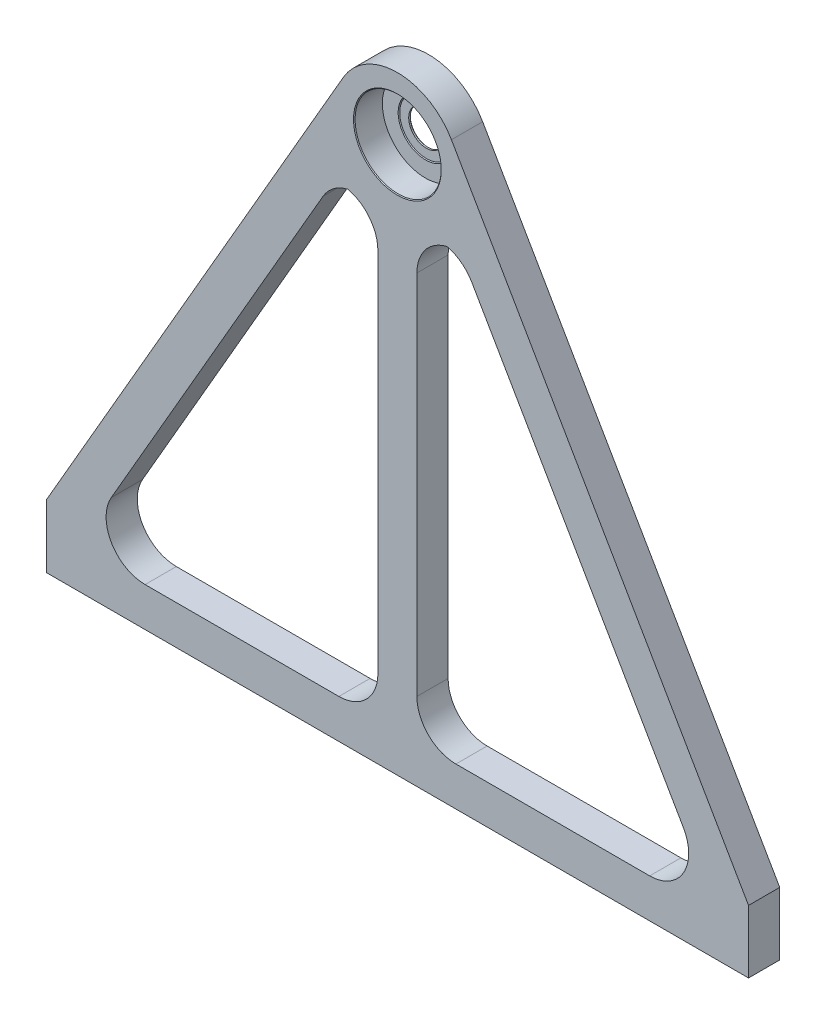
ISO-10303-21;
HEADER;
FILE_DESCRIPTION(('STEP AP214'),'2;1');
FILE_NAME('part.step','',(''),(''),'','','');
FILE_SCHEMA(('AUTOMOTIVE_DESIGN { 1 0 10303 214 1 1 1 1 }'));
ENDSEC;
DATA;
#1=APPLICATION_CONTEXT('core data for automotive mechanical design processes');
#2=APPLICATION_PROTOCOL_DEFINITION('international standard','automotive_design',2000,#1);
#3=PRODUCT_CONTEXT('',#1,'mechanical');
#4=PRODUCT('Part','Part','',(#3));
#5=PRODUCT_RELATED_PRODUCT_CATEGORY('part','',(#4));
#6=PRODUCT_DEFINITION_FORMATION('','',#4);
#7=PRODUCT_DEFINITION_CONTEXT('part definition',#1,'design');
#8=PRODUCT_DEFINITION('design','',#6,#7);
#9=PRODUCT_DEFINITION_SHAPE('','',#8);
#10=(LENGTH_UNIT() NAMED_UNIT(*) SI_UNIT(.MILLI.,.METRE.));
#11=(NAMED_UNIT(*) PLANE_ANGLE_UNIT() SI_UNIT($,.RADIAN.));
#12=(NAMED_UNIT(*) SI_UNIT($,.STERADIAN.) SOLID_ANGLE_UNIT());
#13=UNCERTAINTY_MEASURE_WITH_UNIT(LENGTH_MEASURE(1.E-05),#10,'distance_accuracy_value','');
#14=(GEOMETRIC_REPRESENTATION_CONTEXT(3) GLOBAL_UNCERTAINTY_ASSIGNED_CONTEXT((#13)) GLOBAL_UNIT_ASSIGNED_CONTEXT((#10,
#11,#12)) REPRESENTATION_CONTEXT('',''));
#15=CARTESIAN_POINT('',(0.,0.,0.));
#16=DIRECTION('',(0.,0.,1.));
#17=DIRECTION('',(1.,0.,0.));
#18=AXIS2_PLACEMENT_3D('',#15,#16,#17);
#19=CARTESIAN_POINT('',(13.856406460551,148.,4.));
#20=DIRECTION('',(-0.866025403784437,-0.500000000000004,0.));
#21=DIRECTION('',(0.500000000000004,-0.866025403784437,0.));
#22=AXIS2_PLACEMENT_3D('',#19,#20,#21);
#23=PLANE('',#22);
#24=DIRECTION('',(0.,0.,1.));
#25=VECTOR('',#24,1.);
#26=CARTESIAN_POINT('',(90.,16.1154273188023,4.));
#27=LINE('',#26,#25);
#28=CARTESIAN_POINT('',(90.,16.1154273188024,-4.));
#29=VERTEX_POINT('',#28);
#30=CARTESIAN_POINT('',(90.,16.1154273188024,4.));
#31=VERTEX_POINT('',#30);
#32=EDGE_CURVE('E295',#29,#31,#27,.T.);
#33=ORIENTED_EDGE('',*,*,#32,.F.);
#34=DIRECTION('',(-0.500000000000004,0.866025403784436,0.));
#35=VECTOR('',#34,1.);
#36=CARTESIAN_POINT('',(13.856406460551,148.,-4.));
#37=LINE('',#36,#35);
#38=CARTESIAN_POINT('',(13.856406460551,148.,-4.));
#39=VERTEX_POINT('',#38);
#40=EDGE_CURVE('E338',#29,#39,#37,.T.);
#41=ORIENTED_EDGE('',*,*,#40,.T.);
#42=DIRECTION('',(0.,0.,-1.));
#43=VECTOR('',#42,1.);
#44=CARTESIAN_POINT('',(13.856406460551,148.,4.));
#45=LINE('',#44,#43);
#46=CARTESIAN_POINT('',(13.856406460551,148.,4.));
#47=VERTEX_POINT('',#46);
#48=EDGE_CURVE('E207',#47,#39,#45,.T.);
#49=ORIENTED_EDGE('',*,*,#48,.F.);
#50=DIRECTION('',(-0.500000000000004,0.866025403784436,0.));
#51=VECTOR('',#50,1.);
#52=CARTESIAN_POINT('',(13.856406460551,148.,4.));
#53=LINE('',#52,#51);
#54=EDGE_CURVE('E198',#31,#47,#53,.T.);
#55=ORIENTED_EDGE('',*,*,#54,.F.);
#56=EDGE_LOOP('',(#33,#41,#49,#55));
#57=FACE_BOUND('',#56,.T.);
#58=ADVANCED_FACE('F44',(#57),#23,.F.);
#59=CARTESIAN_POINT('',(-99.3042463006165,0.,4.));
#60=DIRECTION('',(0.866025403784436,-0.500000000000004,0.));
#61=DIRECTION('',(0.500000000000004,0.866025403784437,0.));
#62=AXIS2_PLACEMENT_3D('',#59,#60,#61);
#63=PLANE('',#62);
#64=DIRECTION('',(0.,0.,-1.));
#65=VECTOR('',#64,1.);
#66=CARTESIAN_POINT('',(-90.,16.1154273188024,4.));
#67=LINE('',#66,#65);
#68=CARTESIAN_POINT('',(-90.,16.1154273188023,4.));
#69=VERTEX_POINT('',#68);
#70=CARTESIAN_POINT('',(-90.,16.1154273188023,-4.));
#71=VERTEX_POINT('',#70);
#72=EDGE_CURVE('E59',#69,#71,#67,.T.);
#73=ORIENTED_EDGE('',*,*,#72,.F.);
#74=DIRECTION('',(-0.500000000000004,-0.866025403784436,0.));
#75=VECTOR('',#74,1.);
#76=CARTESIAN_POINT('',(-99.3042463006165,0.,4.));
#77=LINE('',#76,#75);
#78=CARTESIAN_POINT('',(-13.856406460551,148.,4.));
#79=VERTEX_POINT('',#78);
#80=EDGE_CURVE('E208',#79,#69,#77,.T.);
#81=ORIENTED_EDGE('',*,*,#80,.F.);
#82=DIRECTION('',(0.,0.,-1.));
#83=VECTOR('',#82,1.);
#84=CARTESIAN_POINT('',(-13.856406460551,148.,4.));
#85=LINE('',#84,#83);
#86=CARTESIAN_POINT('',(-13.856406460551,148.,-4.));
#87=VERTEX_POINT('',#86);
#88=EDGE_CURVE('E204',#79,#87,#85,.T.);
#89=ORIENTED_EDGE('',*,*,#88,.T.);
#90=DIRECTION('',(-0.500000000000004,-0.866025403784436,0.));
#91=VECTOR('',#90,1.);
#92=CARTESIAN_POINT('',(-99.3042463006165,0.,-4.));
#93=LINE('',#92,#91);
#94=EDGE_CURVE('E196',#87,#71,#93,.T.);
#95=ORIENTED_EDGE('',*,*,#94,.T.);
#96=EDGE_LOOP('',(#73,#81,#89,#95));
#97=FACE_BOUND('',#96,.T.);
#98=ADVANCED_FACE('F353',(#97),#63,.F.);
#99=CARTESIAN_POINT('',(0.,0.,4.));
#100=DIRECTION('',(0.,1.,0.));
#101=DIRECTION('',(0.,0.,1.));
#102=AXIS2_PLACEMENT_3D('',#99,#100,#101);
#103=PLANE('',#102);
#104=DIRECTION('',(0.,0.,1.));
#105=VECTOR('',#104,1.);
#106=CARTESIAN_POINT('',(-90.,0.,-4.));
#107=LINE('',#106,#105);
#108=CARTESIAN_POINT('',(-90.,0.,-4.));
#109=VERTEX_POINT('',#108);
#110=CARTESIAN_POINT('',(-90.,0.,4.));
#111=VERTEX_POINT('',#110);
#112=EDGE_CURVE('E179',#109,#111,#107,.T.);
#113=ORIENTED_EDGE('',*,*,#112,.F.);
#114=DIRECTION('',(1.,0.,0.));
#115=VECTOR('',#114,1.);
#116=CARTESIAN_POINT('',(0.,0.,-4.));
#117=LINE('',#116,#115);
#118=CARTESIAN_POINT('',(90.,0.,-4.));
#119=VERTEX_POINT('',#118);
#120=EDGE_CURVE('E189',#109,#119,#117,.T.);
#121=ORIENTED_EDGE('',*,*,#120,.T.);
#122=DIRECTION('',(0.,0.,1.));
#123=VECTOR('',#122,1.);
#124=CARTESIAN_POINT('',(90.,0.,-4.));
#125=LINE('',#124,#123);
#126=CARTESIAN_POINT('',(90.,0.,4.));
#127=VERTEX_POINT('',#126);
#128=EDGE_CURVE('E66',#119,#127,#125,.T.);
#129=ORIENTED_EDGE('',*,*,#128,.T.);
#130=DIRECTION('',(1.,0.,0.));
#131=VECTOR('',#130,1.);
#132=CARTESIAN_POINT('',(99.3042463006165,0.,4.));
#133=LINE('',#132,#131);
#134=EDGE_CURVE('E191',#111,#127,#133,.T.);
#135=ORIENTED_EDGE('',*,*,#134,.F.);
#136=EDGE_LOOP('',(#113,#121,#129,#135));
#137=FACE_BOUND('',#136,.T.);
#138=ADVANCED_FACE('F188',(#137),#103,.F.);
#139=CARTESIAN_POINT('',(0.,140.,4.));
#140=DIRECTION('',(0.,0.,-1.));
#141=DIRECTION('',(-1.,0.,0.));
#142=AXIS2_PLACEMENT_3D('',#139,#140,#141);
#143=PLANE('',#142);
#144=DIRECTION('',(1.,0.,0.));
#145=VECTOR('',#144,1.);
#146=CARTESIAN_POINT('',(-81.9837382249276,10.,4.));
#147=LINE('',#146,#145);
#148=CARTESIAN_POINT('',(15.,9.99999999999999,4.));
#149=VERTEX_POINT('',#148);
#150=CARTESIAN_POINT('',(64.6632301492388,9.99999999999999,4.));
#151=VERTEX_POINT('',#150);
#152=EDGE_CURVE('E325',#149,#151,#147,.T.);
#153=ORIENTED_EDGE('',*,*,#152,.F.);
#154=CARTESIAN_POINT('',(15.,20.,4.));
#155=DIRECTION('',(0.,0.,-1.));
#156=DIRECTION('',(-1.,0.,0.));
#157=AXIS2_PLACEMENT_3D('',#154,#155,#156);
#158=CIRCLE('',#157,10.);
#159=CARTESIAN_POINT('',(5.00000000000001,20.,4.));
#160=VERTEX_POINT('',#159);
#161=EDGE_CURVE('E260',#149,#160,#158,.T.);
#162=ORIENTED_EDGE('',*,*,#161,.T.);
#163=DIRECTION('',(0.,1.,0.));
#164=VECTOR('',#163,1.);
#165=CARTESIAN_POINT('',(5.00000000000001,10.,4.));
#166=LINE('',#165,#164);
#167=CARTESIAN_POINT('',(5.,114.,4.));
#168=VERTEX_POINT('',#167);
#169=EDGE_CURVE('E302',#160,#168,#166,.T.);
#170=ORIENTED_EDGE('',*,*,#169,.T.);
#171=CARTESIAN_POINT('',(15.,114.,4.));
#172=DIRECTION('',(0.,0.,-1.));
#173=DIRECTION('',(-1.,0.,0.));
#174=AXIS2_PLACEMENT_3D('',#171,#172,#173);
#175=CIRCLE('',#174,10.);
#176=CARTESIAN_POINT('',(12.6961524227067,123.730996163836,4.));
#177=VERTEX_POINT('',#176);
#178=EDGE_CURVE('E264',#168,#177,#175,.T.);
#179=ORIENTED_EDGE('',*,*,#178,.T.);
#180=CARTESIAN_POINT('',(10.3923048454134,114.,4.));
#181=DIRECTION('',(0.,0.,-1.));
#182=DIRECTION('',(-1.,0.,0.));
#183=AXIS2_PLACEMENT_3D('',#180,#181,#182);
#184=CIRCLE('',#183,10.);
#185=CARTESIAN_POINT('',(19.0525588832578,119.,4.));
#186=VERTEX_POINT('',#185);
#187=EDGE_CURVE('E276',#177,#186,#184,.T.);
#188=ORIENTED_EDGE('',*,*,#187,.T.);
#189=DIRECTION('',(-0.500000000000004,0.866025403784436,0.));
#190=VECTOR('',#189,1.);
#191=CARTESIAN_POINT('',(81.9837382249277,9.99999999999999,4.));
#192=LINE('',#191,#190);
#193=CARTESIAN_POINT('',(73.3234841870832,25.,4.));
#194=VERTEX_POINT('',#193);
#195=EDGE_CURVE('E315',#194,#186,#192,.T.);
#196=ORIENTED_EDGE('',*,*,#195,.F.);
#197=CARTESIAN_POINT('',(64.6632301492388,20.,4.));
#198=DIRECTION('',(0.,0.,-1.));
#199=DIRECTION('',(-1.,0.,0.));
#200=AXIS2_PLACEMENT_3D('',#197,#198,#199);
#201=CIRCLE('',#200,10.);
#202=EDGE_CURVE('E272',#194,#151,#201,.T.);
#203=ORIENTED_EDGE('',*,*,#202,.T.);
#204=EDGE_LOOP('',(#153,#162,#170,#179,#188,#196,#203));
#205=FACE_BOUND('',#204,.T.);
#206=CARTESIAN_POINT('',(-64.6632301492388,10.,4.));
#207=VERTEX_POINT('',#206);
#208=CARTESIAN_POINT('',(-15.,10.,4.));
#209=VERTEX_POINT('',#208);
#210=EDGE_CURVE('E328',#207,#209,#147,.T.);
#211=ORIENTED_EDGE('',*,*,#210,.F.);
#212=CARTESIAN_POINT('',(-64.6632301492388,20.,4.));
#213=DIRECTION('',(0.,0.,-1.));
#214=DIRECTION('',(-1.,0.,0.));
#215=AXIS2_PLACEMENT_3D('',#212,#213,#214);
#216=CIRCLE('',#215,10.);
#217=CARTESIAN_POINT('',(-73.3234841870831,25.,4.));
#218=VERTEX_POINT('',#217);
#219=EDGE_CURVE('E284',#207,#218,#216,.T.);
#220=ORIENTED_EDGE('',*,*,#219,.T.);
#221=DIRECTION('',(-0.500000000000004,-0.866025403784436,0.));
#222=VECTOR('',#221,1.);
#223=CARTESIAN_POINT('',(-16.1658075373097,124.,4.));
#224=LINE('',#223,#222);
#225=CARTESIAN_POINT('',(-19.0525588832578,119.,4.));
#226=VERTEX_POINT('',#225);
#227=EDGE_CURVE('E308',#226,#218,#224,.T.);
#228=ORIENTED_EDGE('',*,*,#227,.F.);
#229=CARTESIAN_POINT('',(-10.3923048454134,114.,4.));
#230=DIRECTION('',(0.,0.,-1.));
#231=DIRECTION('',(-1.,0.,0.));
#232=AXIS2_PLACEMENT_3D('',#229,#230,#231);
#233=CIRCLE('',#232,10.);
#234=CARTESIAN_POINT('',(-12.6961524227067,123.730996163836,4.));
#235=VERTEX_POINT('',#234);
#236=EDGE_CURVE('E280',#226,#235,#233,.T.);
#237=ORIENTED_EDGE('',*,*,#236,.T.);
#238=CARTESIAN_POINT('',(-15.,114.,4.));
#239=DIRECTION('',(0.,0.,-1.));
#240=DIRECTION('',(-1.,0.,0.));
#241=AXIS2_PLACEMENT_3D('',#238,#239,#240);
#242=CIRCLE('',#241,10.);
#243=CARTESIAN_POINT('',(-5.,114.,4.));
#244=VERTEX_POINT('',#243);
#245=EDGE_CURVE('E268',#235,#244,#242,.T.);
#246=ORIENTED_EDGE('',*,*,#245,.T.);
#247=DIRECTION('',(0.,1.,0.));
#248=VECTOR('',#247,1.);
#249=CARTESIAN_POINT('',(-4.99999999999999,10.,4.));
#250=LINE('',#249,#248);
#251=CARTESIAN_POINT('',(-4.99999999999999,20.,4.));
#252=VERTEX_POINT('',#251);
#253=EDGE_CURVE('E299',#252,#244,#250,.T.);
#254=ORIENTED_EDGE('',*,*,#253,.F.);
#255=CARTESIAN_POINT('',(-15.,20.,4.));
#256=DIRECTION('',(0.,0.,-1.));
#257=DIRECTION('',(-1.,0.,0.));
#258=AXIS2_PLACEMENT_3D('',#255,#256,#257);
#259=CIRCLE('',#258,10.);
#260=EDGE_CURVE('E256',#252,#209,#259,.T.);
#261=ORIENTED_EDGE('',*,*,#260,.T.);
#262=EDGE_LOOP('',(#211,#220,#228,#237,#246,#254,#261));
#263=FACE_BOUND('',#262,.T.);
#264=CARTESIAN_POINT('',(0.,140.,4.));
#265=DIRECTION('',(0.,0.,-1.));
#266=DIRECTION('',(-1.,0.,0.));
#267=AXIS2_PLACEMENT_3D('',#264,#265,#266);
#268=CIRCLE('',#267,11.25);
#269=CARTESIAN_POINT('',(-11.25,140.,4.));
#270=VERTEX_POINT('',#269);
#271=EDGE_CURVE('E214',#270,#270,#268,.T.);
#272=ORIENTED_EDGE('',*,*,#271,.T.);
#273=EDGE_LOOP('',(#272));
#274=FACE_BOUND('',#273,.T.);
#275=DIRECTION('',(0.,-1.,0.));
#276=VECTOR('',#275,1.);
#277=CARTESIAN_POINT('',(-90.,0.,4.));
#278=LINE('',#277,#276);
#279=EDGE_CURVE('E356',#69,#111,#278,.T.);
#280=ORIENTED_EDGE('',*,*,#279,.T.);
#281=ORIENTED_EDGE('',*,*,#134,.T.);
#282=DIRECTION('',(0.,1.,0.));
#283=VECTOR('',#282,1.);
#284=CARTESIAN_POINT('',(90.,0.,4.));
#285=LINE('',#284,#283);
#286=EDGE_CURVE('E359',#127,#31,#285,.T.);
#287=ORIENTED_EDGE('',*,*,#286,.T.);
#288=ORIENTED_EDGE('',*,*,#54,.T.);
#289=CARTESIAN_POINT('',(0.,140.,4.));
#290=DIRECTION('',(0.,0.,1.));
#291=DIRECTION('',(-1.,0.,0.));
#292=AXIS2_PLACEMENT_3D('',#289,#290,#291);
#293=CIRCLE('',#292,16.);
#294=EDGE_CURVE('E341',#47,#79,#293,.T.);
#295=ORIENTED_EDGE('',*,*,#294,.T.);
#296=ORIENTED_EDGE('',*,*,#80,.T.);
#297=EDGE_LOOP('',(#280,#281,#287,#288,#295,#296));
#298=FACE_BOUND('',#297,.T.);
#299=ADVANCED_FACE('F355',(#205,#263,#274,#298),#143,.F.);
#300=CARTESIAN_POINT('',(0.,140.,-4.));
#301=DIRECTION('',(0.,0.,-1.));
#302=DIRECTION('',(-1.,0.,0.));
#303=AXIS2_PLACEMENT_3D('',#300,#301,#302);
#304=PLANE('',#303);
#305=DIRECTION('',(-0.500000000000004,0.866025403784436,0.));
#306=VECTOR('',#305,1.);
#307=CARTESIAN_POINT('',(81.9837382249277,9.99999999999999,-4.));
#308=LINE('',#307,#306);
#309=CARTESIAN_POINT('',(73.3234841870832,25.,-4.));
#310=VERTEX_POINT('',#309);
#311=CARTESIAN_POINT('',(19.0525588832578,119.,-4.));
#312=VERTEX_POINT('',#311);
#313=EDGE_CURVE('E319',#310,#312,#308,.T.);
#314=ORIENTED_EDGE('',*,*,#313,.T.);
#315=CARTESIAN_POINT('',(10.3923048454134,114.,-4.));
#316=DIRECTION('',(0.,0.,-1.));
#317=DIRECTION('',(-1.,0.,0.));
#318=AXIS2_PLACEMENT_3D('',#315,#316,#317);
#319=CIRCLE('',#318,10.);
#320=CARTESIAN_POINT('',(12.6961524227067,123.730996163836,-4.));
#321=VERTEX_POINT('',#320);
#322=EDGE_CURVE('E278',#312,#321,#319,.F.);
#323=ORIENTED_EDGE('',*,*,#322,.T.);
#324=CARTESIAN_POINT('',(15.,114.,-4.));
#325=DIRECTION('',(0.,0.,-1.));
#326=DIRECTION('',(-1.,0.,0.));
#327=AXIS2_PLACEMENT_3D('',#324,#325,#326);
#328=CIRCLE('',#327,10.);
#329=CARTESIAN_POINT('',(5.,114.,-4.));
#330=VERTEX_POINT('',#329);
#331=EDGE_CURVE('E266',#321,#330,#328,.F.);
#332=ORIENTED_EDGE('',*,*,#331,.T.);
#333=DIRECTION('',(0.,1.,0.));
#334=VECTOR('',#333,1.);
#335=CARTESIAN_POINT('',(5.00000000000001,10.,-4.));
#336=LINE('',#335,#334);
#337=CARTESIAN_POINT('',(5.00000000000001,20.,-4.));
#338=VERTEX_POINT('',#337);
#339=EDGE_CURVE('E289',#338,#330,#336,.T.);
#340=ORIENTED_EDGE('',*,*,#339,.F.);
#341=CARTESIAN_POINT('',(15.,20.,-4.));
#342=DIRECTION('',(0.,0.,-1.));
#343=DIRECTION('',(-1.,0.,0.));
#344=AXIS2_PLACEMENT_3D('',#341,#342,#343);
#345=CIRCLE('',#344,10.);
#346=CARTESIAN_POINT('',(15.,9.99999999999999,-4.));
#347=VERTEX_POINT('',#346);
#348=EDGE_CURVE('E262',#338,#347,#345,.F.);
#349=ORIENTED_EDGE('',*,*,#348,.T.);
#350=DIRECTION('',(1.,0.,0.));
#351=VECTOR('',#350,1.);
#352=CARTESIAN_POINT('',(-81.9837382249276,10.,-4.));
#353=LINE('',#352,#351);
#354=CARTESIAN_POINT('',(64.6632301492388,9.99999999999999,-4.));
#355=VERTEX_POINT('',#354);
#356=EDGE_CURVE('E314',#347,#355,#353,.T.);
#357=ORIENTED_EDGE('',*,*,#356,.T.);
#358=CARTESIAN_POINT('',(64.6632301492388,20.,-4.));
#359=DIRECTION('',(0.,0.,-1.));
#360=DIRECTION('',(-1.,0.,0.));
#361=AXIS2_PLACEMENT_3D('',#358,#359,#360);
#362=CIRCLE('',#361,10.);
#363=EDGE_CURVE('E274',#355,#310,#362,.F.);
#364=ORIENTED_EDGE('',*,*,#363,.T.);
#365=EDGE_LOOP('',(#314,#323,#332,#340,#349,#357,#364));
#366=FACE_BOUND('',#365,.T.);
#367=CARTESIAN_POINT('',(-15.,114.,-4.));
#368=DIRECTION('',(0.,0.,-1.));
#369=DIRECTION('',(-1.,0.,0.));
#370=AXIS2_PLACEMENT_3D('',#367,#368,#369);
#371=CIRCLE('',#370,10.);
#372=CARTESIAN_POINT('',(-5.,114.,-4.));
#373=VERTEX_POINT('',#372);
#374=CARTESIAN_POINT('',(-12.6961524227067,123.730996163836,-4.));
#375=VERTEX_POINT('',#374);
#376=EDGE_CURVE('E270',#373,#375,#371,.F.);
#377=ORIENTED_EDGE('',*,*,#376,.T.);
#378=CARTESIAN_POINT('',(-10.3923048454134,114.,-4.));
#379=DIRECTION('',(0.,0.,-1.));
#380=DIRECTION('',(-1.,0.,0.));
#381=AXIS2_PLACEMENT_3D('',#378,#379,#380);
#382=CIRCLE('',#381,10.);
#383=CARTESIAN_POINT('',(-19.0525588832578,119.,-4.));
#384=VERTEX_POINT('',#383);
#385=EDGE_CURVE('E282',#375,#384,#382,.F.);
#386=ORIENTED_EDGE('',*,*,#385,.T.);
#387=DIRECTION('',(-0.500000000000004,-0.866025403784436,0.));
#388=VECTOR('',#387,1.);
#389=CARTESIAN_POINT('',(-16.1658075373097,124.,-4.));
#390=LINE('',#389,#388);
#391=CARTESIAN_POINT('',(-73.3234841870831,25.,-4.));
#392=VERTEX_POINT('',#391);
#393=EDGE_CURVE('E311',#384,#392,#390,.T.);
#394=ORIENTED_EDGE('',*,*,#393,.T.);
#395=CARTESIAN_POINT('',(-64.6632301492388,20.,-4.));
#396=DIRECTION('',(0.,0.,-1.));
#397=DIRECTION('',(-1.,0.,0.));
#398=AXIS2_PLACEMENT_3D('',#395,#396,#397);
#399=CIRCLE('',#398,10.);
#400=CARTESIAN_POINT('',(-64.6632301492388,10.,-4.));
#401=VERTEX_POINT('',#400);
#402=EDGE_CURVE('E52',#392,#401,#399,.F.);
#403=ORIENTED_EDGE('',*,*,#402,.T.);
#404=CARTESIAN_POINT('',(-15.,10.,-4.));
#405=VERTEX_POINT('',#404);
#406=EDGE_CURVE('E318',#401,#405,#353,.T.);
#407=ORIENTED_EDGE('',*,*,#406,.T.);
#408=CARTESIAN_POINT('',(-15.,20.,-4.));
#409=DIRECTION('',(0.,0.,-1.));
#410=DIRECTION('',(-1.,0.,0.));
#411=AXIS2_PLACEMENT_3D('',#408,#409,#410);
#412=CIRCLE('',#411,10.);
#413=CARTESIAN_POINT('',(-4.99999999999999,20.,-4.));
#414=VERTEX_POINT('',#413);
#415=EDGE_CURVE('E258',#405,#414,#412,.F.);
#416=ORIENTED_EDGE('',*,*,#415,.T.);
#417=DIRECTION('',(0.,1.,0.));
#418=VECTOR('',#417,1.);
#419=CARTESIAN_POINT('',(-4.99999999999999,10.,-4.));
#420=LINE('',#419,#418);
#421=EDGE_CURVE('E305',#414,#373,#420,.T.);
#422=ORIENTED_EDGE('',*,*,#421,.T.);
#423=EDGE_LOOP('',(#377,#386,#394,#403,#407,#416,#422));
#424=FACE_BOUND('',#423,.T.);
#425=CARTESIAN_POINT('',(0.,140.,-4.));
#426=DIRECTION('',(0.,0.,-1.));
#427=DIRECTION('',(-1.,0.,0.));
#428=AXIS2_PLACEMENT_3D('',#425,#426,#427);
#429=CIRCLE('',#428,4.70000000000007);
#430=CARTESIAN_POINT('',(-4.70000000000007,140.,-4.));
#431=VERTEX_POINT('',#430);
#432=EDGE_CURVE('E217',#431,#431,#429,.F.);
#433=ORIENTED_EDGE('',*,*,#432,.T.);
#434=EDGE_LOOP('',(#433));
#435=FACE_BOUND('',#434,.T.);
#436=ORIENTED_EDGE('',*,*,#120,.F.);
#437=DIRECTION('',(0.,1.,0.));
#438=VECTOR('',#437,1.);
#439=CARTESIAN_POINT('',(-90.,140.,-4.));
#440=LINE('',#439,#438);
#441=EDGE_CURVE('E13',#109,#71,#440,.T.);
#442=ORIENTED_EDGE('',*,*,#441,.T.);
#443=ORIENTED_EDGE('',*,*,#94,.F.);
#444=CARTESIAN_POINT('',(0.,140.,-4.));
#445=DIRECTION('',(0.,0.,1.));
#446=DIRECTION('',(-1.,0.,0.));
#447=AXIS2_PLACEMENT_3D('',#444,#445,#446);
#448=CIRCLE('',#447,16.);
#449=EDGE_CURVE('E200',#39,#87,#448,.T.);
#450=ORIENTED_EDGE('',*,*,#449,.F.);
#451=ORIENTED_EDGE('',*,*,#40,.F.);
#452=DIRECTION('',(0.,1.,0.));
#453=VECTOR('',#452,1.);
#454=CARTESIAN_POINT('',(90.,0.,-4.));
#455=LINE('',#454,#453);
#456=EDGE_CURVE('E192',#119,#29,#455,.T.);
#457=ORIENTED_EDGE('',*,*,#456,.F.);
#458=EDGE_LOOP('',(#436,#442,#443,#450,#451,#457));
#459=FACE_BOUND('',#458,.T.);
#460=ADVANCED_FACE('F194',(#366,#424,#435,#459),#304,.T.);
#461=CARTESIAN_POINT('',(-81.9837382249276,10.,-4.));
#462=DIRECTION('',(0.,-1.,0.));
#463=DIRECTION('',(1.,0.,0.));
#464=AXIS2_PLACEMENT_3D('',#461,#462,#463);
#465=PLANE('',#464);
#466=ORIENTED_EDGE('',*,*,#210,.T.);
#467=DIRECTION('',(0.,0.,1.));
#468=VECTOR('',#467,1.);
#469=CARTESIAN_POINT('',(-15.,10.,-4.));
#470=LINE('',#469,#468);
#471=EDGE_CURVE('E235',#209,#405,#470,.F.);
#472=ORIENTED_EDGE('',*,*,#471,.T.);
#473=ORIENTED_EDGE('',*,*,#406,.F.);
#474=DIRECTION('',(0.,0.,1.));
#475=VECTOR('',#474,1.);
#476=CARTESIAN_POINT('',(-64.6632301492388,10.,4.));
#477=LINE('',#476,#475);
#478=EDGE_CURVE('E232',#401,#207,#477,.T.);
#479=ORIENTED_EDGE('',*,*,#478,.T.);
#480=EDGE_LOOP('',(#466,#472,#473,#479));
#481=FACE_BOUND('',#480,.T.);
#482=ADVANCED_FACE('F465',(#481),#465,.F.);
#483=CARTESIAN_POINT('',(0.,140.,4.));
#484=DIRECTION('',(0.,0.,-1.));
#485=DIRECTION('',(-1.,0.,0.));
#486=AXIS2_PLACEMENT_3D('',#483,#484,#485);
#487=CYLINDRICAL_SURFACE('',#486,16.);
#488=ORIENTED_EDGE('',*,*,#88,.F.);
#489=ORIENTED_EDGE('',*,*,#294,.F.);
#490=ORIENTED_EDGE('',*,*,#48,.T.);
#491=ORIENTED_EDGE('',*,*,#449,.T.);
#492=EDGE_LOOP('',(#488,#489,#490,#491));
#493=FACE_BOUND('',#492,.T.);
#494=ADVANCED_FACE('F348',(#493),#487,.T.);
#495=CARTESIAN_POINT('',(0.,140.,-3.2));
#496=DIRECTION('',(0.,0.,-1.));
#497=DIRECTION('',(-1.,0.,0.));
#498=AXIS2_PLACEMENT_3D('',#495,#496,#497);
#499=PLANE('',#498);
#500=CARTESIAN_POINT('',(0.,140.,-3.2));
#501=DIRECTION('',(0.,0.,1.));
#502=DIRECTION('',(1.,0.,0.));
#503=AXIS2_PLACEMENT_3D('',#500,#501,#502);
#504=CIRCLE('',#503,7.00000000000001);
#505=CARTESIAN_POINT('',(7.00000000000001,140.,-3.2));
#506=VERTEX_POINT('',#505);
#507=EDGE_CURVE('E333',#506,#506,#504,.T.);
#508=ORIENTED_EDGE('',*,*,#507,.F.);
#509=EDGE_LOOP('',(#508));
#510=FACE_BOUND('',#509,.T.);
#511=CARTESIAN_POINT('',(0.,140.,-3.2));
#512=DIRECTION('',(0.,0.,-1.));
#513=DIRECTION('',(-1.,0.,0.));
#514=AXIS2_PLACEMENT_3D('',#511,#512,#513);
#515=CIRCLE('',#514,11.05);
#516=CARTESIAN_POINT('',(-11.05,140.,-3.2));
#517=VERTEX_POINT('',#516);
#518=EDGE_CURVE('E336',#517,#517,#515,.F.);
#519=ORIENTED_EDGE('',*,*,#518,.T.);
#520=EDGE_LOOP('',(#519));
#521=FACE_BOUND('',#520,.T.);
#522=ADVANCED_FACE('F478',(#510,#521),#499,.F.);
#523=CARTESIAN_POINT('',(0.,140.,-35.2541197284454));
#524=DIRECTION('',(0.,0.,1.));
#525=DIRECTION('',(1.,0.,0.));
#526=AXIS2_PLACEMENT_3D('',#523,#524,#525);
#527=CYLINDRICAL_SURFACE('',#526,11.05);
#528=CARTESIAN_POINT('',(0.,140.,3.79999999999999));
#529=DIRECTION('',(0.,0.,-1.));
#530=DIRECTION('',(-1.,0.,0.));
#531=AXIS2_PLACEMENT_3D('',#528,#529,#530);
#532=CIRCLE('',#531,11.05);
#533=CARTESIAN_POINT('',(-11.05,140.,3.79999999999999));
#534=VERTEX_POINT('',#533);
#535=EDGE_CURVE('E211',#534,#534,#532,.F.);
#536=ORIENTED_EDGE('',*,*,#535,.T.);
#537=EDGE_LOOP('',(#536));
#538=FACE_BOUND('',#537,.T.);
#539=ORIENTED_EDGE('',*,*,#518,.F.);
#540=EDGE_LOOP('',(#539));
#541=FACE_BOUND('',#540,.T.);
#542=ADVANCED_FACE('F509',(#538,#541),#527,.F.);
#543=CARTESIAN_POINT('',(0.,140.,-3.4));
#544=DIRECTION('',(0.,0.,1.));
#545=DIRECTION('',(1.,0.,0.));
#546=AXIS2_PLACEMENT_3D('',#543,#544,#545);
#547=PLANE('',#546);
#548=CARTESIAN_POINT('',(0.,140.,-3.4));
#549=DIRECTION('',(0.,0.,1.));
#550=DIRECTION('',(1.,0.,0.));
#551=AXIS2_PLACEMENT_3D('',#548,#549,#550);
#552=CIRCLE('',#551,6.79999999999994);
#553=CARTESIAN_POINT('',(6.79999999999994,140.,-3.4));
#554=VERTEX_POINT('',#553);
#555=EDGE_CURVE('E223',#554,#554,#552,.T.);
#556=ORIENTED_EDGE('',*,*,#555,.T.);
#557=EDGE_LOOP('',(#556));
#558=FACE_BOUND('',#557,.T.);
#559=CARTESIAN_POINT('',(0.,140.,-3.4));
#560=DIRECTION('',(0.,0.,1.));
#561=DIRECTION('',(1.,0.,0.));
#562=AXIS2_PLACEMENT_3D('',#559,#560,#561);
#563=CIRCLE('',#562,4.50000000000001);
#564=CARTESIAN_POINT('',(4.5,140.,-3.4));
#565=VERTEX_POINT('',#564);
#566=EDGE_CURVE('E322',#565,#565,#563,.T.);
#567=ORIENTED_EDGE('',*,*,#566,.F.);
#568=EDGE_LOOP('',(#567));
#569=FACE_BOUND('',#568,.T.);
#570=ADVANCED_FACE('F512',(#558,#569),#547,.T.);
#571=CARTESIAN_POINT('',(0.,140.,-4.));
#572=DIRECTION('',(0.,0.,1.));
#573=DIRECTION('',(1.,0.,0.));
#574=AXIS2_PLACEMENT_3D('',#571,#572,#573);
#575=CYLINDRICAL_SURFACE('',#574,4.50000000000001);
#576=CARTESIAN_POINT('',(0.,140.,-3.79999999999996));
#577=DIRECTION('',(0.,0.,-1.));
#578=DIRECTION('',(-1.,0.,0.));
#579=AXIS2_PLACEMENT_3D('',#576,#577,#578);
#580=CIRCLE('',#579,4.50000000000001);
#581=CARTESIAN_POINT('',(-4.50000000000001,140.,-3.79999999999996));
#582=VERTEX_POINT('',#581);
#583=EDGE_CURVE('E220',#582,#582,#580,.T.);
#584=ORIENTED_EDGE('',*,*,#583,.T.);
#585=EDGE_LOOP('',(#584));
#586=FACE_BOUND('',#585,.T.);
#587=ORIENTED_EDGE('',*,*,#566,.T.);
#588=EDGE_LOOP('',(#587));
#589=FACE_BOUND('',#588,.T.);
#590=ADVANCED_FACE('F393',(#586,#589),#575,.F.);
#591=CARTESIAN_POINT('',(0.,140.,3.79999999999999));
#592=DIRECTION('',(0.,0.,1.));
#593=DIRECTION('',(1.,0.,0.));
#594=AXIS2_PLACEMENT_3D('',#591,#592,#593);
#595=CONICAL_SURFACE('',#594,11.05,0.785398163397362);
#596=ORIENTED_EDGE('',*,*,#271,.F.);
#597=EDGE_LOOP('',(#596));
#598=FACE_BOUND('',#597,.T.);
#599=ORIENTED_EDGE('',*,*,#535,.F.);
#600=EDGE_LOOP('',(#599));
#601=FACE_BOUND('',#600,.T.);
#602=ADVANCED_FACE('F386',(#598,#601),#595,.F.);
#603=CARTESIAN_POINT('',(0.,140.,-4.));
#604=DIRECTION('',(0.,0.,-1.));
#605=DIRECTION('',(-1.,0.,0.));
#606=AXIS2_PLACEMENT_3D('',#603,#604,#605);
#607=CONICAL_SURFACE('',#606,4.70000000000007,0.785398163397507);
#608=ORIENTED_EDGE('',*,*,#583,.F.);
#609=EDGE_LOOP('',(#608));
#610=FACE_BOUND('',#609,.T.);
#611=ORIENTED_EDGE('',*,*,#432,.F.);
#612=EDGE_LOOP('',(#611));
#613=FACE_BOUND('',#612,.T.);
#614=ADVANCED_FACE('F392',(#610,#613),#607,.F.);
#615=CARTESIAN_POINT('',(0.,140.,-3.4));
#616=DIRECTION('',(0.,0.,1.));
#617=DIRECTION('',(1.,0.,0.));
#618=AXIS2_PLACEMENT_3D('',#615,#616,#617);
#619=CONICAL_SURFACE('',#618,6.79999999999994,0.785398163397455);
#620=ORIENTED_EDGE('',*,*,#507,.T.);
#621=EDGE_LOOP('',(#620));
#622=FACE_BOUND('',#621,.T.);
#623=ORIENTED_EDGE('',*,*,#555,.F.);
#624=EDGE_LOOP('',(#623));
#625=FACE_BOUND('',#624,.T.);
#626=ADVANCED_FACE('F400',(#622,#625),#619,.F.);
#627=CARTESIAN_POINT('',(-16.1658075373097,124.,-4.));
#628=DIRECTION('',(-0.866025403784436,0.500000000000004,0.));
#629=DIRECTION('',(-0.500000000000004,-0.866025403784437,0.));
#630=AXIS2_PLACEMENT_3D('',#627,#628,#629);
#631=PLANE('',#630);
#632=ORIENTED_EDGE('',*,*,#393,.F.);
#633=DIRECTION('',(0.,0.,1.));
#634=VECTOR('',#633,1.);
#635=CARTESIAN_POINT('',(-19.0525588832578,119.,4.));
#636=LINE('',#635,#634);
#637=EDGE_CURVE('E254',#384,#226,#636,.T.);
#638=ORIENTED_EDGE('',*,*,#637,.T.);
#639=ORIENTED_EDGE('',*,*,#227,.T.);
#640=DIRECTION('',(0.,0.,1.));
#641=VECTOR('',#640,1.);
#642=CARTESIAN_POINT('',(-73.3234841870832,25.,-4.));
#643=LINE('',#642,#641);
#644=EDGE_CURVE('E252',#218,#392,#643,.F.);
#645=ORIENTED_EDGE('',*,*,#644,.T.);
#646=EDGE_LOOP('',(#632,#638,#639,#645));
#647=FACE_BOUND('',#646,.T.);
#648=ADVANCED_FACE('F406',(#647),#631,.F.);
#649=CARTESIAN_POINT('',(81.9837382249277,9.99999999999999,-4.));
#650=DIRECTION('',(0.866025403784436,0.500000000000004,0.));
#651=DIRECTION('',(-0.500000000000004,0.866025403784437,0.));
#652=AXIS2_PLACEMENT_3D('',#649,#650,#651);
#653=PLANE('',#652);
#654=ORIENTED_EDGE('',*,*,#313,.F.);
#655=DIRECTION('',(0.,0.,1.));
#656=VECTOR('',#655,1.);
#657=CARTESIAN_POINT('',(73.3234841870832,25.,4.));
#658=LINE('',#657,#656);
#659=EDGE_CURVE('E249',#310,#194,#658,.T.);
#660=ORIENTED_EDGE('',*,*,#659,.T.);
#661=ORIENTED_EDGE('',*,*,#195,.T.);
#662=DIRECTION('',(0.,0.,1.));
#663=VECTOR('',#662,1.);
#664=CARTESIAN_POINT('',(19.0525588832578,119.,-4.));
#665=LINE('',#664,#663);
#666=EDGE_CURVE('E247',#186,#312,#665,.F.);
#667=ORIENTED_EDGE('',*,*,#666,.T.);
#668=EDGE_LOOP('',(#654,#660,#661,#667));
#669=FACE_BOUND('',#668,.T.);
#670=ADVANCED_FACE('F444',(#669),#653,.F.);
#671=ORIENTED_EDGE('',*,*,#356,.F.);
#672=DIRECTION('',(0.,0.,1.));
#673=VECTOR('',#672,1.);
#674=CARTESIAN_POINT('',(15.,9.99999999999999,-4.));
#675=LINE('',#674,#673);
#676=EDGE_CURVE('E239',#347,#149,#675,.T.);
#677=ORIENTED_EDGE('',*,*,#676,.T.);
#678=ORIENTED_EDGE('',*,*,#152,.T.);
#679=DIRECTION('',(0.,0.,1.));
#680=VECTOR('',#679,1.);
#681=CARTESIAN_POINT('',(64.6632301492388,9.99999999999999,-4.));
#682=LINE('',#681,#680);
#683=EDGE_CURVE('E237',#151,#355,#682,.F.);
#684=ORIENTED_EDGE('',*,*,#683,.T.);
#685=EDGE_LOOP('',(#671,#677,#678,#684));
#686=FACE_BOUND('',#685,.T.);
#687=ADVANCED_FACE('F462',(#686),#465,.F.);
#688=CARTESIAN_POINT('',(5.00000000000001,10.,-118.43775600736));
#689=DIRECTION('',(1.,0.,0.));
#690=DIRECTION('',(0.,1.,0.));
#691=AXIS2_PLACEMENT_3D('',#688,#689,#690);
#692=PLANE('',#691);
#693=ORIENTED_EDGE('',*,*,#169,.F.);
#694=DIRECTION('',(0.,0.,1.));
#695=VECTOR('',#694,1.);
#696=CARTESIAN_POINT('',(5.00000000000001,20.,-118.43775600736));
#697=LINE('',#696,#695);
#698=EDGE_CURVE('E245',#160,#338,#697,.F.);
#699=ORIENTED_EDGE('',*,*,#698,.T.);
#700=ORIENTED_EDGE('',*,*,#339,.T.);
#701=DIRECTION('',(0.,0.,1.));
#702=VECTOR('',#701,1.);
#703=CARTESIAN_POINT('',(5.,114.,-118.43775600736));
#704=LINE('',#703,#702);
#705=EDGE_CURVE('E242',#330,#168,#704,.T.);
#706=ORIENTED_EDGE('',*,*,#705,.T.);
#707=EDGE_LOOP('',(#693,#699,#700,#706));
#708=FACE_BOUND('',#707,.T.);
#709=ADVANCED_FACE('F455',(#708),#692,.T.);
#710=CARTESIAN_POINT('',(-4.99999999999999,10.,-118.43775600736));
#711=DIRECTION('',(1.,0.,0.));
#712=DIRECTION('',(0.,1.,0.));
#713=AXIS2_PLACEMENT_3D('',#710,#711,#712);
#714=PLANE('',#713);
#715=ORIENTED_EDGE('',*,*,#421,.F.);
#716=DIRECTION('',(0.,0.,1.));
#717=VECTOR('',#716,1.);
#718=CARTESIAN_POINT('',(-4.99999999999999,20.,4.));
#719=LINE('',#718,#717);
#720=EDGE_CURVE('E229',#414,#252,#719,.T.);
#721=ORIENTED_EDGE('',*,*,#720,.T.);
#722=ORIENTED_EDGE('',*,*,#253,.T.);
#723=DIRECTION('',(0.,0.,1.));
#724=VECTOR('',#723,1.);
#725=CARTESIAN_POINT('',(-5.,114.,-4.));
#726=LINE('',#725,#724);
#727=EDGE_CURVE('E226',#244,#373,#726,.F.);
#728=ORIENTED_EDGE('',*,*,#727,.T.);
#729=EDGE_LOOP('',(#715,#721,#722,#728));
#730=FACE_BOUND('',#729,.T.);
#731=ADVANCED_FACE('F412',(#730),#714,.F.);
#732=CARTESIAN_POINT('',(-15.,20.,-118.43775600736));
#733=DIRECTION('',(0.,0.,-1.));
#734=DIRECTION('',(-1.,0.,0.));
#735=AXIS2_PLACEMENT_3D('',#732,#733,#734);
#736=CYLINDRICAL_SURFACE('',#735,10.);
#737=ORIENTED_EDGE('',*,*,#415,.F.);
#738=ORIENTED_EDGE('',*,*,#471,.F.);
#739=ORIENTED_EDGE('',*,*,#260,.F.);
#740=ORIENTED_EDGE('',*,*,#720,.F.);
#741=EDGE_LOOP('',(#737,#738,#739,#740));
#742=FACE_BOUND('',#741,.T.);
#743=ADVANCED_FACE('F408',(#742),#736,.F.);
#744=CARTESIAN_POINT('',(15.,20.,-4.));
#745=DIRECTION('',(0.,0.,1.));
#746=DIRECTION('',(1.,0.,0.));
#747=AXIS2_PLACEMENT_3D('',#744,#745,#746);
#748=CYLINDRICAL_SURFACE('',#747,10.);
#749=ORIENTED_EDGE('',*,*,#348,.F.);
#750=ORIENTED_EDGE('',*,*,#698,.F.);
#751=ORIENTED_EDGE('',*,*,#161,.F.);
#752=ORIENTED_EDGE('',*,*,#676,.F.);
#753=EDGE_LOOP('',(#749,#750,#751,#752));
#754=FACE_BOUND('',#753,.T.);
#755=ADVANCED_FACE('F411',(#754),#748,.F.);
#756=CARTESIAN_POINT('',(10.3923048454134,114.,-4.));
#757=DIRECTION('',(0.,0.,-1.));
#758=DIRECTION('',(-1.,0.,0.));
#759=AXIS2_PLACEMENT_3D('',#756,#757,#758);
#760=CYLINDRICAL_SURFACE('',#759,10.);
#761=DIRECTION('',(0.,0.,-1.));
#762=VECTOR('',#761,1.);
#763=CARTESIAN_POINT('',(12.6961524227067,123.730996163836,0.));
#764=LINE('',#763,#762);
#765=EDGE_CURVE('E287',#321,#177,#764,.F.);
#766=ORIENTED_EDGE('',*,*,#765,.F.);
#767=ORIENTED_EDGE('',*,*,#322,.F.);
#768=ORIENTED_EDGE('',*,*,#666,.F.);
#769=ORIENTED_EDGE('',*,*,#187,.F.);
#770=EDGE_LOOP('',(#766,#767,#768,#769));
#771=FACE_BOUND('',#770,.T.);
#772=ADVANCED_FACE('F416',(#771),#760,.F.);
#773=CARTESIAN_POINT('',(15.,114.,-118.43775600736));
#774=DIRECTION('',(0.,0.,1.));
#775=DIRECTION('',(1.,0.,0.));
#776=AXIS2_PLACEMENT_3D('',#773,#774,#775);
#777=CYLINDRICAL_SURFACE('',#776,10.);
#778=ORIENTED_EDGE('',*,*,#331,.F.);
#779=ORIENTED_EDGE('',*,*,#765,.T.);
#780=ORIENTED_EDGE('',*,*,#178,.F.);
#781=ORIENTED_EDGE('',*,*,#705,.F.);
#782=EDGE_LOOP('',(#778,#779,#780,#781));
#783=FACE_BOUND('',#782,.T.);
#784=ADVANCED_FACE('F418',(#783),#777,.F.);
#785=CARTESIAN_POINT('',(-10.3923048454134,114.,-4.));
#786=DIRECTION('',(0.,0.,-1.));
#787=DIRECTION('',(-1.,0.,0.));
#788=AXIS2_PLACEMENT_3D('',#785,#786,#787);
#789=CYLINDRICAL_SURFACE('',#788,10.);
#790=ORIENTED_EDGE('',*,*,#637,.F.);
#791=ORIENTED_EDGE('',*,*,#385,.F.);
#792=DIRECTION('',(0.,0.,-1.));
#793=VECTOR('',#792,1.);
#794=CARTESIAN_POINT('',(-12.6961524227067,123.730996163836,0.));
#795=LINE('',#794,#793);
#796=EDGE_CURVE('E290',#235,#375,#795,.T.);
#797=ORIENTED_EDGE('',*,*,#796,.F.);
#798=ORIENTED_EDGE('',*,*,#236,.F.);
#799=EDGE_LOOP('',(#790,#791,#797,#798));
#800=FACE_BOUND('',#799,.T.);
#801=ADVANCED_FACE('F421',(#800),#789,.F.);
#802=CARTESIAN_POINT('',(-15.,114.,-4.));
#803=DIRECTION('',(0.,0.,-1.));
#804=DIRECTION('',(-1.,0.,0.));
#805=AXIS2_PLACEMENT_3D('',#802,#803,#804);
#806=CYLINDRICAL_SURFACE('',#805,10.);
#807=ORIENTED_EDGE('',*,*,#376,.F.);
#808=ORIENTED_EDGE('',*,*,#727,.F.);
#809=ORIENTED_EDGE('',*,*,#245,.F.);
#810=ORIENTED_EDGE('',*,*,#796,.T.);
#811=EDGE_LOOP('',(#807,#808,#809,#810));
#812=FACE_BOUND('',#811,.T.);
#813=ADVANCED_FACE('F426',(#812),#806,.F.);
#814=CARTESIAN_POINT('',(64.6632301492388,20.,-4.));
#815=DIRECTION('',(0.,0.,-1.));
#816=DIRECTION('',(-1.,0.,0.));
#817=AXIS2_PLACEMENT_3D('',#814,#815,#816);
#818=CYLINDRICAL_SURFACE('',#817,10.);
#819=ORIENTED_EDGE('',*,*,#363,.F.);
#820=ORIENTED_EDGE('',*,*,#683,.F.);
#821=ORIENTED_EDGE('',*,*,#202,.F.);
#822=ORIENTED_EDGE('',*,*,#659,.F.);
#823=EDGE_LOOP('',(#819,#820,#821,#822));
#824=FACE_BOUND('',#823,.T.);
#825=ADVANCED_FACE('F375',(#824),#818,.F.);
#826=CARTESIAN_POINT('',(-64.6632301492388,20.,-4.));
#827=DIRECTION('',(0.,0.,-1.));
#828=DIRECTION('',(-1.,0.,0.));
#829=AXIS2_PLACEMENT_3D('',#826,#827,#828);
#830=CYLINDRICAL_SURFACE('',#829,10.);
#831=ORIENTED_EDGE('',*,*,#402,.F.);
#832=ORIENTED_EDGE('',*,*,#644,.F.);
#833=ORIENTED_EDGE('',*,*,#219,.F.);
#834=ORIENTED_EDGE('',*,*,#478,.F.);
#835=EDGE_LOOP('',(#831,#832,#833,#834));
#836=FACE_BOUND('',#835,.T.);
#837=ADVANCED_FACE('F46',(#836),#830,.F.);
#838=CARTESIAN_POINT('',(90.,0.,-4.));
#839=DIRECTION('',(1.,0.,0.));
#840=DIRECTION('',(0.,0.,-1.));
#841=AXIS2_PLACEMENT_3D('',#838,#839,#840);
#842=PLANE('',#841);
#843=ORIENTED_EDGE('',*,*,#32,.T.);
#844=ORIENTED_EDGE('',*,*,#286,.F.);
#845=ORIENTED_EDGE('',*,*,#128,.F.);
#846=ORIENTED_EDGE('',*,*,#456,.T.);
#847=EDGE_LOOP('',(#843,#844,#845,#846));
#848=FACE_BOUND('',#847,.T.);
#849=ADVANCED_FACE('F362',(#848),#842,.T.);
#850=CARTESIAN_POINT('',(-90.,0.,-4.));
#851=DIRECTION('',(-1.,0.,0.));
#852=DIRECTION('',(0.,0.,1.));
#853=AXIS2_PLACEMENT_3D('',#850,#851,#852);
#854=PLANE('',#853);
#855=ORIENTED_EDGE('',*,*,#72,.T.);
#856=ORIENTED_EDGE('',*,*,#441,.F.);
#857=ORIENTED_EDGE('',*,*,#112,.T.);
#858=ORIENTED_EDGE('',*,*,#279,.F.);
#859=EDGE_LOOP('',(#855,#856,#857,#858));
#860=FACE_BOUND('',#859,.T.);
#861=ADVANCED_FACE('F178',(#860),#854,.T.);
#862=CLOSED_SHELL('',(#58,#98,#138,#299,#460,#482,#494,#522,#542,#570,#590,#602,#614,#626,#648,
#670,#687,#709,#731,#743,#755,#772,#784,#801,#813,#825,#837,#849,#861));
#863=MANIFOLD_SOLID_BREP('B2',#862);
#864=ADVANCED_BREP_SHAPE_REPRESENTATION('',(#18,#863),#14);
#865=SHAPE_DEFINITION_REPRESENTATION(#9,#864);
ENDSEC;
END-ISO-10303-21;
